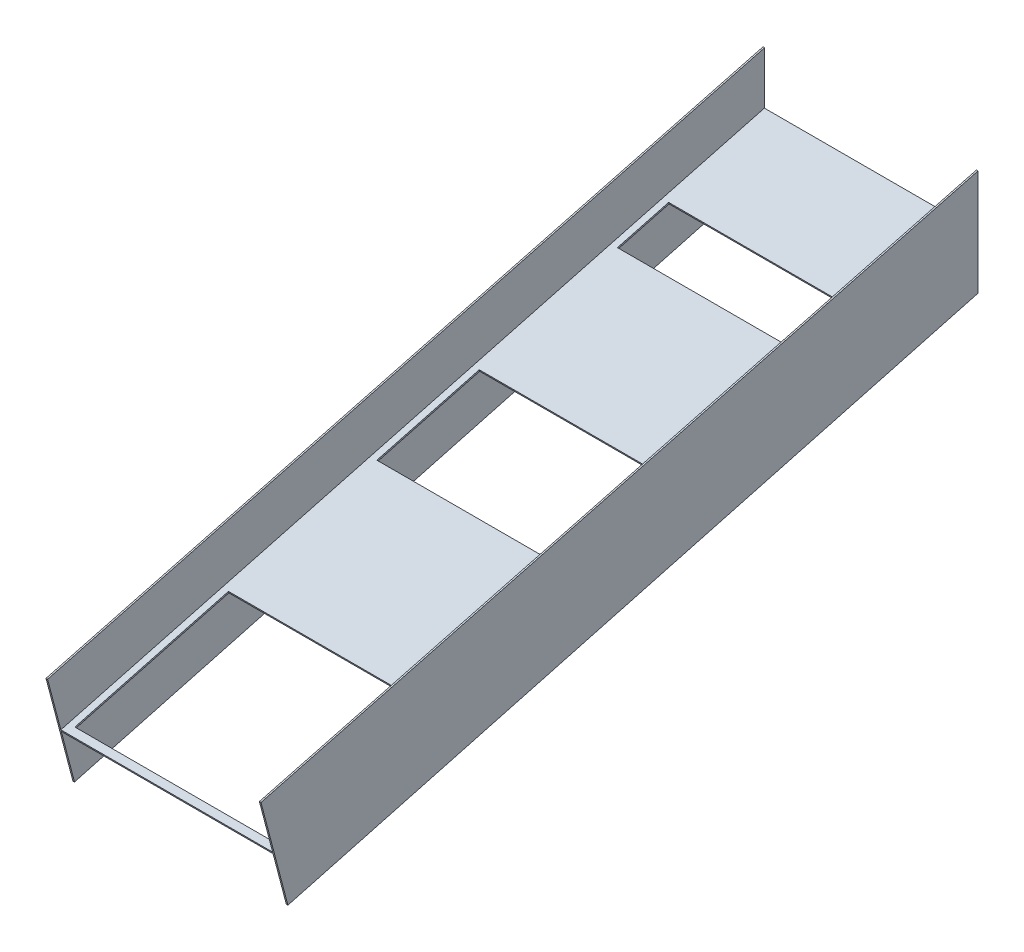
ISO-10303-21;
HEADER;
FILE_DESCRIPTION(('STEP AP214'),'2;1');
FILE_NAME('part.step','',(''),(''),'','','');
FILE_SCHEMA(('AUTOMOTIVE_DESIGN { 1 0 10303 214 1 1 1 1 }'));
ENDSEC;
DATA;
#1=APPLICATION_CONTEXT('core data for automotive mechanical design processes');
#2=APPLICATION_PROTOCOL_DEFINITION('international standard','automotive_design',2000,#1);
#3=PRODUCT_CONTEXT('',#1,'mechanical');
#4=PRODUCT('Part','Part','',(#3));
#5=PRODUCT_RELATED_PRODUCT_CATEGORY('part','',(#4));
#6=PRODUCT_DEFINITION_FORMATION('','',#4);
#7=PRODUCT_DEFINITION_CONTEXT('part definition',#1,'design');
#8=PRODUCT_DEFINITION('design','',#6,#7);
#9=PRODUCT_DEFINITION_SHAPE('','',#8);
#10=(LENGTH_UNIT() NAMED_UNIT(*) SI_UNIT(.MILLI.,.METRE.));
#11=(NAMED_UNIT(*) PLANE_ANGLE_UNIT() SI_UNIT($,.RADIAN.));
#12=(NAMED_UNIT(*) SI_UNIT($,.STERADIAN.) SOLID_ANGLE_UNIT());
#13=UNCERTAINTY_MEASURE_WITH_UNIT(LENGTH_MEASURE(1.E-05),#10,'distance_accuracy_value','');
#14=(GEOMETRIC_REPRESENTATION_CONTEXT(3) GLOBAL_UNCERTAINTY_ASSIGNED_CONTEXT((#13)) GLOBAL_UNIT_ASSIGNED_CONTEXT((#10,
#11,#12)) REPRESENTATION_CONTEXT('',''));
#15=CARTESIAN_POINT('',(0.,0.,0.));
#16=DIRECTION('',(0.,0.,1.));
#17=DIRECTION('',(1.,0.,0.));
#18=AXIS2_PLACEMENT_3D('',#15,#16,#17);
#19=CARTESIAN_POINT('',(-403.,0.,0.));
#20=DIRECTION('',(1.,0.,0.));
#21=DIRECTION('',(0.,0.,-1.));
#22=AXIS2_PLACEMENT_3D('',#19,#20,#21);
#23=PLANE('',#22);
#24=DIRECTION('',(0.,-1.,0.));
#25=VECTOR('',#24,1.);
#26=CARTESIAN_POINT('',(-403.,-200.,0.));
#27=LINE('',#26,#25);
#28=CARTESIAN_POINT('',(-403.,-100.,0.));
#29=VERTEX_POINT('',#28);
#30=CARTESIAN_POINT('',(-403.,-101.551888617157,0.));
#31=VERTEX_POINT('',#30);
#32=EDGE_CURVE('E11',#29,#31,#27,.T.);
#33=ORIENTED_EDGE('',*,*,#32,.F.);
#34=DIRECTION('',(0.,0.966564213060326,0.256424690759436));
#35=VECTOR('',#34,1.);
#36=CARTESIAN_POINT('',(-403.,-101.44984631959,-0.384637036139165));
#37=LINE('',#36,#35);
#38=CARTESIAN_POINT('',(-403.,-101.44984631959,-0.384637036139165));
#39=VERTEX_POINT('',#38);
#40=EDGE_CURVE('E876',#39,#29,#37,.T.);
#41=ORIENTED_EDGE('',*,*,#40,.F.);
#42=DIRECTION('',(0.,-0.256424690759435,0.966564213060327));
#43=VECTOR('',#42,1.);
#44=CARTESIAN_POINT('',(-403.,-101.44984631959,-0.384637036139165));
#45=LINE('',#44,#43);
#46=EDGE_CURVE('E459',#39,#31,#45,.T.);
#47=ORIENTED_EDGE('',*,*,#46,.T.);
#48=EDGE_LOOP('',(#33,#41,#47));
#49=FACE_BOUND('',#48,.T.);
#50=ADVANCED_FACE('F39',(#49),#23,.F.);
#51=CARTESIAN_POINT('',(-3.,0.,0.));
#52=DIRECTION('',(-1.,0.,0.));
#53=DIRECTION('',(0.,0.,1.));
#54=AXIS2_PLACEMENT_3D('',#51,#52,#53);
#55=PLANE('',#54);
#56=DIRECTION('',(0.,1.,0.));
#57=VECTOR('',#56,1.);
#58=CARTESIAN_POINT('',(-3.,0.,0.));
#59=LINE('',#58,#57);
#60=CARTESIAN_POINT('',(-3.,-100.,0.));
#61=VERTEX_POINT('',#60);
#62=CARTESIAN_POINT('',(-3.,0.,0.));
#63=VERTEX_POINT('',#62);
#64=EDGE_CURVE('E569',#61,#63,#59,.T.);
#65=ORIENTED_EDGE('',*,*,#64,.F.);
#66=DIRECTION('',(0.,0.966564213060326,0.256424690759436));
#67=VECTOR('',#66,1.);
#68=CARTESIAN_POINT('',(-3.,-101.44984631959,-0.384637036139165));
#69=LINE('',#68,#67);
#70=CARTESIAN_POINT('',(-3.,-98.5501536804095,0.38463703613914));
#71=VERTEX_POINT('',#70);
#72=EDGE_CURVE('E476',#61,#71,#69,.T.);
#73=ORIENTED_EDGE('',*,*,#72,.T.);
#74=DIRECTION('',(0.,-0.256424690759435,0.966564213060327));
#75=VECTOR('',#74,1.);
#76=CARTESIAN_POINT('',(-3.,-98.5501536804095,0.38463703613914));
#77=LINE('',#76,#75);
#78=CARTESIAN_POINT('',(-3.,-451.029111549455,1329.01467466633));
#79=VERTEX_POINT('',#78);
#80=EDGE_CURVE('E474',#71,#79,#77,.T.);
#81=ORIENTED_EDGE('',*,*,#80,.T.);
#82=CARTESIAN_POINT('',(-3.,-355.762035513731,1354.04334276534));
#83=DIRECTION('',(0.,-0.967173816260954,-0.254115739652666));
#84=VECTOR('',#83,1.);
#85=LINE('',#82,#84);
#86=CARTESIAN_POINT('',(-3.,-355.762035513731,1354.04334276534));
#87=VERTEX_POINT('',#86);
#88=EDGE_CURVE('E514',#87,#79,#85,.T.);
#89=ORIENTED_EDGE('',*,*,#88,.F.);
#90=DIRECTION('',(0.,-0.254115739652665,0.967173816260955));
#91=VECTOR('',#90,1.);
#92=CARTESIAN_POINT('',(-3.,0.,0.));
#93=LINE('',#92,#91);
#94=EDGE_CURVE('E576',#63,#87,#93,.T.);
#95=ORIENTED_EDGE('',*,*,#94,.F.);
#96=EDGE_LOOP('',(#65,#73,#81,#89,#95));
#97=FACE_BOUND('',#96,.T.);
#98=ADVANCED_FACE('F412',(#97),#55,.T.);
#99=CARTESIAN_POINT('',(-3.,0.,0.));
#100=DIRECTION('',(0.,0.,-1.));
#101=DIRECTION('',(0.,1.,0.));
#102=AXIS2_PLACEMENT_3D('',#99,#100,#101);
#103=PLANE('',#102);
#104=DIRECTION('',(0.,1.,0.));
#105=VECTOR('',#104,1.);
#106=CARTESIAN_POINT('',(0.,0.,0.));
#107=LINE('',#106,#105);
#108=CARTESIAN_POINT('',(0.,-200.,0.));
#109=VERTEX_POINT('',#108);
#110=CARTESIAN_POINT('',(0.,0.,0.));
#111=VERTEX_POINT('',#110);
#112=EDGE_CURVE('E553',#109,#111,#107,.T.);
#113=ORIENTED_EDGE('',*,*,#112,.F.);
#114=DIRECTION('',(1.,0.,0.));
#115=VECTOR('',#114,1.);
#116=CARTESIAN_POINT('',(-3.,-200.,0.));
#117=LINE('',#116,#115);
#118=CARTESIAN_POINT('',(-3.,-200.,0.));
#119=VERTEX_POINT('',#118);
#120=EDGE_CURVE('E488',#119,#109,#117,.T.);
#121=ORIENTED_EDGE('',*,*,#120,.F.);
#122=CARTESIAN_POINT('',(-3.,-101.551888617157,0.));
#123=VERTEX_POINT('',#122);
#124=EDGE_CURVE('E565',#119,#123,#59,.T.);
#125=ORIENTED_EDGE('',*,*,#124,.T.);
#126=EDGE_CURVE('E571',#123,#61,#59,.T.);
#127=ORIENTED_EDGE('',*,*,#126,.T.);
#128=ORIENTED_EDGE('',*,*,#64,.T.);
#129=DIRECTION('',(1.,0.,0.));
#130=VECTOR('',#129,1.);
#131=CARTESIAN_POINT('',(-3.,0.,0.));
#132=LINE('',#131,#130);
#133=EDGE_CURVE('E505',#63,#111,#132,.T.);
#134=ORIENTED_EDGE('',*,*,#133,.T.);
#135=EDGE_LOOP('',(#113,#121,#125,#127,#128,#134));
#136=FACE_BOUND('',#135,.T.);
#137=ADVANCED_FACE('F41',(#136),#103,.T.);
#138=CARTESIAN_POINT('',(-3.,-549.196798765922,1303.2201948348));
#139=DIRECTION('',(0.,-0.965925826289067,-0.258819045102525));
#140=DIRECTION('',(0.,0.258819045102525,-0.965925826289067));
#141=AXIS2_PLACEMENT_3D('',#138,#139,#140);
#142=PLANE('',#141);
#143=DIRECTION('',(0.,0.258819045102525,-0.965925826289067));
#144=VECTOR('',#143,1.);
#145=CARTESIAN_POINT('',(0.,-549.196798765922,1303.2201948348));
#146=LINE('',#145,#144);
#147=CARTESIAN_POINT('',(0.,-549.196798765922,1303.2201948348));
#148=VERTEX_POINT('',#147);
#149=EDGE_CURVE('E503',#148,#109,#146,.T.);
#150=ORIENTED_EDGE('',*,*,#149,.F.);
#151=DIRECTION('',(1.,0.,0.));
#152=VECTOR('',#151,1.);
#153=CARTESIAN_POINT('',(-3.,-549.196798765922,1303.2201948348));
#154=LINE('',#153,#152);
#155=CARTESIAN_POINT('',(-3.,-549.196798765922,1303.2201948348));
#156=VERTEX_POINT('',#155);
#157=EDGE_CURVE('E492',#156,#148,#154,.T.);
#158=ORIENTED_EDGE('',*,*,#157,.F.);
#159=DIRECTION('',(0.,0.258819045102525,-0.965925826289067));
#160=VECTOR('',#159,1.);
#161=CARTESIAN_POINT('',(-3.,-549.196798765922,1303.2201948348));
#162=LINE('',#161,#160);
#163=EDGE_CURVE('E508',#156,#119,#162,.T.);
#164=ORIENTED_EDGE('',*,*,#163,.T.);
#165=ORIENTED_EDGE('',*,*,#120,.T.);
#166=EDGE_LOOP('',(#150,#158,#164,#165));
#167=FACE_BOUND('',#166,.T.);
#168=ADVANCED_FACE('F532',(#167),#142,.T.);
#169=CARTESIAN_POINT('',(-3.,-355.762035513731,1354.04334276534));
#170=DIRECTION('',(0.,-0.254115739652666,0.967173816260954));
#171=DIRECTION('',(0.,-0.967173816260955,-0.254115739652666));
#172=AXIS2_PLACEMENT_3D('',#169,#170,#171);
#173=PLANE('',#172);
#174=DIRECTION('',(0.,-0.967173816260954,-0.254115739652666));
#175=VECTOR('',#174,1.);
#176=CARTESIAN_POINT('',(0.,-355.762035513731,1354.04334276534));
#177=LINE('',#176,#175);
#178=CARTESIAN_POINT('',(0.,-355.762035513731,1354.04334276534));
#179=VERTEX_POINT('',#178);
#180=EDGE_CURVE('E552',#179,#148,#177,.T.);
#181=ORIENTED_EDGE('',*,*,#180,.F.);
#182=DIRECTION('',(1.,0.,0.));
#183=VECTOR('',#182,1.);
#184=CARTESIAN_POINT('',(-3.,-355.762035513731,1354.04334276534));
#185=LINE('',#184,#183);
#186=EDGE_CURVE('E499',#87,#179,#185,.T.);
#187=ORIENTED_EDGE('',*,*,#186,.F.);
#188=ORIENTED_EDGE('',*,*,#88,.T.);
#189=CARTESIAN_POINT('',(-3.,-451.028652278673,1329.01294349644));
#190=DIRECTION('',(0.,-0.967173816260954,-0.254115739652669));
#191=VECTOR('',#190,1.);
#192=LINE('',#189,#191);
#193=CARTESIAN_POINT('',(-3.,-453.929722730199,1328.24886293381));
#194=VERTEX_POINT('',#193);
#195=EDGE_CURVE('E482',#79,#194,#192,.T.);
#196=ORIENTED_EDGE('',*,*,#195,.T.);
#197=CARTESIAN_POINT('',(-3.,-453.930182000981,1328.2505941037));
#198=DIRECTION('',(0.,-0.967173816260954,-0.254115739652666));
#199=VECTOR('',#198,1.);
#200=LINE('',#197,#199);
#201=EDGE_CURVE('E579',#194,#156,#200,.T.);
#202=ORIENTED_EDGE('',*,*,#201,.T.);
#203=ORIENTED_EDGE('',*,*,#157,.T.);
#204=EDGE_LOOP('',(#181,#187,#188,#196,#202,#203));
#205=FACE_BOUND('',#204,.T.);
#206=ADVANCED_FACE('F522',(#205),#173,.T.);
#207=CARTESIAN_POINT('',(-3.,0.,0.));
#208=DIRECTION('',(0.,0.967173816260955,0.254115739652665));
#209=DIRECTION('',(0.,-0.254115739652665,0.967173816260955));
#210=AXIS2_PLACEMENT_3D('',#207,#208,#209);
#211=PLANE('',#210);
#212=DIRECTION('',(0.,-0.254115739652665,0.967173816260955));
#213=VECTOR('',#212,1.);
#214=CARTESIAN_POINT('',(0.,0.,0.));
#215=LINE('',#214,#213);
#216=EDGE_CURVE('E544',#111,#179,#215,.T.);
#217=ORIENTED_EDGE('',*,*,#216,.F.);
#218=ORIENTED_EDGE('',*,*,#133,.F.);
#219=ORIENTED_EDGE('',*,*,#94,.T.);
#220=ORIENTED_EDGE('',*,*,#186,.T.);
#221=EDGE_LOOP('',(#217,#218,#219,#220));
#222=FACE_BOUND('',#221,.T.);
#223=ADVANCED_FACE('F531',(#222),#211,.T.);
#224=DIRECTION('',(0.,-0.256424690759435,0.966564213060327));
#225=VECTOR('',#224,1.);
#226=CARTESIAN_POINT('',(-3.,-101.44984631959,-0.384637036139165));
#227=LINE('',#226,#225);
#228=EDGE_CURVE('E49',#123,#194,#227,.T.);
#229=ORIENTED_EDGE('',*,*,#228,.F.);
#230=ORIENTED_EDGE('',*,*,#124,.F.);
#231=ORIENTED_EDGE('',*,*,#163,.F.);
#232=ORIENTED_EDGE('',*,*,#201,.F.);
#233=EDGE_LOOP('',(#229,#230,#231,#232));
#234=FACE_BOUND('',#233,.T.);
#235=ADVANCED_FACE('F535',(#234),#55,.T.);
#236=CARTESIAN_POINT('',(0.,0.,0.));
#237=DIRECTION('',(-1.,0.,0.));
#238=DIRECTION('',(0.,0.,1.));
#239=AXIS2_PLACEMENT_3D('',#236,#237,#238);
#240=PLANE('',#239);
#241=ORIENTED_EDGE('',*,*,#112,.T.);
#242=ORIENTED_EDGE('',*,*,#216,.T.);
#243=ORIENTED_EDGE('',*,*,#180,.T.);
#244=ORIENTED_EDGE('',*,*,#149,.T.);
#245=EDGE_LOOP('',(#241,#242,#243,#244));
#246=FACE_BOUND('',#245,.T.);
#247=ADVANCED_FACE('F417',(#246),#240,.F.);
#248=CARTESIAN_POINT('',(-3.,0.,0.));
#249=DIRECTION('',(1.,0.,0.));
#250=DIRECTION('',(0.,0.,-1.));
#251=AXIS2_PLACEMENT_3D('',#248,#249,#250);
#252=PLANE('',#251);
#253=ORIENTED_EDGE('',*,*,#126,.F.);
#254=CARTESIAN_POINT('',(-3.,-101.44984631959,-0.384637036139165));
#255=VERTEX_POINT('',#254);
#256=EDGE_CURVE('E862',#255,#123,#227,.T.);
#257=ORIENTED_EDGE('',*,*,#256,.F.);
#258=EDGE_CURVE('E469',#255,#61,#69,.T.);
#259=ORIENTED_EDGE('',*,*,#258,.T.);
#260=EDGE_LOOP('',(#253,#257,#259));
#261=FACE_BOUND('',#260,.T.);
#262=ADVANCED_FACE('F414',(#261),#252,.T.);
#263=CARTESIAN_POINT('',(-403.,-101.44984631959,-0.384637036139165));
#264=DIRECTION('',(0.,0.966564213060326,0.256424690759435));
#265=DIRECTION('',(0.,-0.256424690759435,0.966564213060326));
#266=AXIS2_PLACEMENT_3D('',#263,#264,#265);
#267=PLANE('',#266);
#268=DIRECTION('',(1.,0.,0.));
#269=VECTOR('',#268,1.);
#270=CARTESIAN_POINT('',(-390.5,-178.377253547421,289.584626881959));
#271=LINE('',#270,#269);
#272=CARTESIAN_POINT('',(-390.5,-178.377253547421,289.584626881959));
#273=VERTEX_POINT('',#272);
#274=CARTESIAN_POINT('',(-15.5,-178.377253547421,289.584626881959));
#275=VERTEX_POINT('',#274);
#276=EDGE_CURVE('E230',#273,#275,#271,.T.);
#277=ORIENTED_EDGE('',*,*,#276,.T.);
#278=DIRECTION('',(0.,0.256424690759435,-0.966564213060326));
#279=VECTOR('',#278,1.);
#280=CARTESIAN_POINT('',(-15.5,-152.734784471478,192.928205575926));
#281=LINE('',#280,#279);
#282=CARTESIAN_POINT('',(-15.5,-152.734784471478,192.928205575926));
#283=VERTEX_POINT('',#282);
#284=EDGE_CURVE('E221',#275,#283,#281,.T.);
#285=ORIENTED_EDGE('',*,*,#284,.T.);
#286=DIRECTION('',(-1.,0.,0.));
#287=VECTOR('',#286,1.);
#288=CARTESIAN_POINT('',(-390.5,-152.734784471478,192.928205575926));
#289=LINE('',#288,#287);
#290=CARTESIAN_POINT('',(-390.5,-152.734784471478,192.928205575926));
#291=VERTEX_POINT('',#290);
#292=EDGE_CURVE('E233',#283,#291,#289,.T.);
#293=ORIENTED_EDGE('',*,*,#292,.T.);
#294=DIRECTION('',(0.,-0.256424690759435,0.966564213060326));
#295=VECTOR('',#294,1.);
#296=CARTESIAN_POINT('',(-390.5,-152.734784471478,192.928205575926));
#297=LINE('',#296,#295);
#298=EDGE_CURVE('E59',#291,#273,#297,.T.);
#299=ORIENTED_EDGE('',*,*,#298,.T.);
#300=EDGE_LOOP('',(#277,#285,#293,#299));
#301=FACE_BOUND('',#300,.T.);
#302=DIRECTION('',(1.,0.,0.));
#303=VECTOR('',#302,1.);
#304=CARTESIAN_POINT('',(-390.5,-298.896858204356,743.869807020312));
#305=LINE('',#304,#303);
#306=CARTESIAN_POINT('',(-390.5,-298.896858204356,743.869807020312));
#307=VERTEX_POINT('',#306);
#308=CARTESIAN_POINT('',(-15.4999999999998,-298.896858204356,743.869807020312));
#309=VERTEX_POINT('',#308);
#310=EDGE_CURVE('E282',#307,#309,#305,.T.);
#311=ORIENTED_EDGE('',*,*,#310,.T.);
#312=DIRECTION('',(0.,0.256424690759435,-0.966564213060326));
#313=VECTOR('',#312,1.);
#314=CARTESIAN_POINT('',(-15.4999999999998,-247.611920052469,550.556964408247));
#315=LINE('',#314,#313);
#316=CARTESIAN_POINT('',(-15.4999999999998,-247.611920052469,550.556964408247));
#317=VERTEX_POINT('',#316);
#318=EDGE_CURVE('E271',#309,#317,#315,.T.);
#319=ORIENTED_EDGE('',*,*,#318,.T.);
#320=DIRECTION('',(-1.,0.,0.));
#321=VECTOR('',#320,1.);
#322=CARTESIAN_POINT('',(-390.5,-247.611920052469,550.556964408247));
#323=LINE('',#322,#321);
#324=CARTESIAN_POINT('',(-390.5,-247.611920052469,550.556964408247));
#325=VERTEX_POINT('',#324);
#326=EDGE_CURVE('E275',#317,#325,#323,.T.);
#327=ORIENTED_EDGE('',*,*,#326,.T.);
#328=DIRECTION('',(0.,-0.256424690759435,0.966564213060326));
#329=VECTOR('',#328,1.);
#330=CARTESIAN_POINT('',(-390.5,-247.611920052469,550.556964408247));
#331=LINE('',#330,#329);
#332=EDGE_CURVE('E67',#325,#307,#331,.T.);
#333=ORIENTED_EDGE('',*,*,#332,.T.);
#334=EDGE_LOOP('',(#311,#319,#327,#333));
#335=FACE_BOUND('',#334,.T.);
#336=DIRECTION('',(1.,0.,0.));
#337=VECTOR('',#336,1.);
#338=CARTESIAN_POINT('',(-390.5,-450.187425752422,1314.14269272591));
#339=LINE('',#338,#337);
#340=CARTESIAN_POINT('',(-390.5,-450.187425752422,1314.14269272591));
#341=VERTEX_POINT('',#340);
#342=CARTESIAN_POINT('',(-15.4999999999998,-450.187425752422,1314.14269272591));
#343=VERTEX_POINT('',#342);
#344=EDGE_CURVE('E326',#341,#343,#339,.T.);
#345=ORIENTED_EDGE('',*,*,#344,.T.);
#346=DIRECTION('',(0.,0.256424690759435,-0.966564213060326));
#347=VECTOR('',#346,1.);
#348=CARTESIAN_POINT('',(-15.4999999999998,-373.260018524592,1024.17342880781));
#349=LINE('',#348,#347);
#350=CARTESIAN_POINT('',(-15.4999999999998,-373.260018524592,1024.17342880781));
#351=VERTEX_POINT('',#350);
#352=EDGE_CURVE('E313',#343,#351,#349,.T.);
#353=ORIENTED_EDGE('',*,*,#352,.T.);
#354=DIRECTION('',(-1.,0.,0.));
#355=VECTOR('',#354,1.);
#356=CARTESIAN_POINT('',(-390.5,-373.260018524592,1024.17342880781));
#357=LINE('',#356,#355);
#358=CARTESIAN_POINT('',(-390.5,-373.260018524592,1024.17342880781));
#359=VERTEX_POINT('',#358);
#360=EDGE_CURVE('E317',#351,#359,#357,.T.);
#361=ORIENTED_EDGE('',*,*,#360,.T.);
#362=DIRECTION('',(0.,-0.256424690759435,0.966564213060326));
#363=VECTOR('',#362,1.);
#364=CARTESIAN_POINT('',(-390.5,-373.260018524592,1024.17342880781));
#365=LINE('',#364,#363);
#366=EDGE_CURVE('E322',#359,#341,#365,.T.);
#367=ORIENTED_EDGE('',*,*,#366,.T.);
#368=EDGE_LOOP('',(#345,#353,#361,#367));
#369=FACE_BOUND('',#368,.T.);
#370=ORIENTED_EDGE('',*,*,#256,.T.);
#371=ORIENTED_EDGE('',*,*,#228,.T.);
#372=DIRECTION('',(1.,0.,0.));
#373=VECTOR('',#372,1.);
#374=CARTESIAN_POINT('',(-403.,-453.929263459417,1328.24713176393));
#375=LINE('',#374,#373);
#376=CARTESIAN_POINT('',(-403.,-453.929722730199,1328.24886293381));
#377=VERTEX_POINT('',#376);
#378=EDGE_CURVE('E558',#377,#194,#375,.T.);
#379=ORIENTED_EDGE('',*,*,#378,.F.);
#380=EDGE_CURVE('E43',#31,#377,#45,.T.);
#381=ORIENTED_EDGE('',*,*,#380,.F.);
#382=ORIENTED_EDGE('',*,*,#46,.F.);
#383=DIRECTION('',(1.,0.,0.));
#384=VECTOR('',#383,1.);
#385=CARTESIAN_POINT('',(-403.,-101.44984631959,-0.384637036139165));
#386=LINE('',#385,#384);
#387=EDGE_CURVE('E918',#39,#255,#386,.T.);
#388=ORIENTED_EDGE('',*,*,#387,.T.);
#389=EDGE_LOOP('',(#370,#371,#379,#381,#382,#388));
#390=FACE_BOUND('',#389,.T.);
#391=ADVANCED_FACE('F238',(#301,#335,#369,#390),#267,.F.);
#392=CARTESIAN_POINT('',(-403.,-451.029570820236,1329.01640583621));
#393=DIRECTION('',(0.,-0.256424690759414,0.966564213060332));
#394=DIRECTION('',(0.,-0.966564213060332,-0.256424690759414));
#395=AXIS2_PLACEMENT_3D('',#392,#393,#394);
#396=PLANE('',#395);
#397=ORIENTED_EDGE('',*,*,#195,.F.);
#398=DIRECTION('',(1.,0.,0.));
#399=VECTOR('',#398,1.);
#400=CARTESIAN_POINT('',(-403.,-451.029570820236,1329.01640583621));
#401=LINE('',#400,#399);
#402=CARTESIAN_POINT('',(-403.,-451.029111549455,1329.01467466633));
#403=VERTEX_POINT('',#402);
#404=EDGE_CURVE('E562',#403,#79,#401,.T.);
#405=ORIENTED_EDGE('',*,*,#404,.F.);
#406=CARTESIAN_POINT('',(-403.,-451.029570820236,1329.01640583621));
#407=DIRECTION('',(0.,-0.966564213060332,-0.256424690759413));
#408=VECTOR('',#407,1.);
#409=LINE('',#406,#408);
#410=EDGE_CURVE('E456',#403,#377,#409,.T.);
#411=ORIENTED_EDGE('',*,*,#410,.T.);
#412=ORIENTED_EDGE('',*,*,#378,.T.);
#413=EDGE_LOOP('',(#397,#405,#411,#412));
#414=FACE_BOUND('',#413,.T.);
#415=ADVANCED_FACE('F426',(#414),#396,.T.);
#416=CARTESIAN_POINT('',(-403.,-98.5501536804095,0.38463703613914));
#417=DIRECTION('',(0.,0.966564213060326,0.256424690759435));
#418=DIRECTION('',(0.,-0.256424690759435,0.966564213060326));
#419=AXIS2_PLACEMENT_3D('',#416,#417,#418);
#420=PLANE('',#419);
#421=DIRECTION('',(0.,0.256424690759435,-0.966564213060326));
#422=VECTOR('',#421,1.);
#423=CARTESIAN_POINT('',(-15.5,-149.835091832297,193.697479648204));
#424=LINE('',#423,#422);
#425=CARTESIAN_POINT('',(-15.5,-175.47756090824,290.353900954237));
#426=VERTEX_POINT('',#425);
#427=CARTESIAN_POINT('',(-15.5,-149.835091832297,193.697479648204));
#428=VERTEX_POINT('',#427);
#429=EDGE_CURVE('E224',#426,#428,#424,.T.);
#430=ORIENTED_EDGE('',*,*,#429,.F.);
#431=DIRECTION('',(1.,0.,0.));
#432=VECTOR('',#431,1.);
#433=CARTESIAN_POINT('',(-390.5,-175.47756090824,290.353900954237));
#434=LINE('',#433,#432);
#435=CARTESIAN_POINT('',(-390.5,-175.47756090824,290.353900954237));
#436=VERTEX_POINT('',#435);
#437=EDGE_CURVE('E242',#436,#426,#434,.T.);
#438=ORIENTED_EDGE('',*,*,#437,.F.);
#439=DIRECTION('',(0.,-0.256424690759435,0.966564213060326));
#440=VECTOR('',#439,1.);
#441=CARTESIAN_POINT('',(-390.5,-149.835091832297,193.697479648204));
#442=LINE('',#441,#440);
#443=CARTESIAN_POINT('',(-390.5,-149.835091832297,193.697479648204));
#444=VERTEX_POINT('',#443);
#445=EDGE_CURVE('E246',#444,#436,#442,.T.);
#446=ORIENTED_EDGE('',*,*,#445,.F.);
#447=DIRECTION('',(-1.,0.,0.));
#448=VECTOR('',#447,1.);
#449=CARTESIAN_POINT('',(-390.5,-149.835091832297,193.697479648204));
#450=LINE('',#449,#448);
#451=EDGE_CURVE('E255',#428,#444,#450,.T.);
#452=ORIENTED_EDGE('',*,*,#451,.F.);
#453=EDGE_LOOP('',(#430,#438,#446,#452));
#454=FACE_BOUND('',#453,.T.);
#455=DIRECTION('',(0.,0.256424690759435,-0.966564213060326));
#456=VECTOR('',#455,1.);
#457=CARTESIAN_POINT('',(-15.4999999999998,-244.712227413288,551.326238480525));
#458=LINE('',#457,#456);
#459=CARTESIAN_POINT('',(-15.4999999999998,-295.997165565175,744.63908109259));
#460=VERTEX_POINT('',#459);
#461=CARTESIAN_POINT('',(-15.4999999999998,-244.712227413288,551.326238480525));
#462=VERTEX_POINT('',#461);
#463=EDGE_CURVE('E287',#460,#462,#458,.T.);
#464=ORIENTED_EDGE('',*,*,#463,.F.);
#465=DIRECTION('',(1.,0.,0.));
#466=VECTOR('',#465,1.);
#467=CARTESIAN_POINT('',(-390.5,-295.997165565175,744.63908109259));
#468=LINE('',#467,#466);
#469=CARTESIAN_POINT('',(-390.5,-295.997165565175,744.63908109259));
#470=VERTEX_POINT('',#469);
#471=EDGE_CURVE('E276',#470,#460,#468,.T.);
#472=ORIENTED_EDGE('',*,*,#471,.F.);
#473=DIRECTION('',(0.,-0.256424690759435,0.966564213060326));
#474=VECTOR('',#473,1.);
#475=CARTESIAN_POINT('',(-390.5,-244.712227413288,551.326238480525));
#476=LINE('',#475,#474);
#477=CARTESIAN_POINT('',(-390.5,-244.712227413288,551.326238480525));
#478=VERTEX_POINT('',#477);
#479=EDGE_CURVE('E295',#478,#470,#476,.T.);
#480=ORIENTED_EDGE('',*,*,#479,.F.);
#481=DIRECTION('',(-1.,0.,0.));
#482=VECTOR('',#481,1.);
#483=CARTESIAN_POINT('',(-390.5,-244.712227413288,551.326238480525));
#484=LINE('',#483,#482);
#485=EDGE_CURVE('E290',#462,#478,#484,.T.);
#486=ORIENTED_EDGE('',*,*,#485,.F.);
#487=EDGE_LOOP('',(#464,#472,#480,#486));
#488=FACE_BOUND('',#487,.T.);
#489=DIRECTION('',(0.,0.256424690759435,-0.966564213060326));
#490=VECTOR('',#489,1.);
#491=CARTESIAN_POINT('',(-15.4999999999998,-370.360325885411,1024.94270288009));
#492=LINE('',#491,#490);
#493=CARTESIAN_POINT('',(-15.4999999999998,-447.287733113241,1314.91196679818));
#494=VERTEX_POINT('',#493);
#495=CARTESIAN_POINT('',(-15.4999999999998,-370.360325885411,1024.94270288009));
#496=VERTEX_POINT('',#495);
#497=EDGE_CURVE('E331',#494,#496,#492,.T.);
#498=ORIENTED_EDGE('',*,*,#497,.F.);
#499=DIRECTION('',(1.,0.,0.));
#500=VECTOR('',#499,1.);
#501=CARTESIAN_POINT('',(-390.5,-447.287733113241,1314.91196679818));
#502=LINE('',#501,#500);
#503=CARTESIAN_POINT('',(-390.5,-447.287733113241,1314.91196679818));
#504=VERTEX_POINT('',#503);
#505=EDGE_CURVE('E318',#504,#494,#502,.T.);
#506=ORIENTED_EDGE('',*,*,#505,.F.);
#507=DIRECTION('',(0.,-0.256424690759435,0.966564213060326));
#508=VECTOR('',#507,1.);
#509=CARTESIAN_POINT('',(-390.5,-370.360325885411,1024.94270288009));
#510=LINE('',#509,#508);
#511=CARTESIAN_POINT('',(-390.5,-370.360325885411,1024.94270288009));
#512=VERTEX_POINT('',#511);
#513=EDGE_CURVE('E338',#512,#504,#510,.T.);
#514=ORIENTED_EDGE('',*,*,#513,.F.);
#515=DIRECTION('',(-1.,0.,0.));
#516=VECTOR('',#515,1.);
#517=CARTESIAN_POINT('',(-390.5,-370.360325885411,1024.94270288009));
#518=LINE('',#517,#516);
#519=EDGE_CURVE('E334',#496,#512,#518,.T.);
#520=ORIENTED_EDGE('',*,*,#519,.F.);
#521=EDGE_LOOP('',(#498,#506,#514,#520));
#522=FACE_BOUND('',#521,.T.);
#523=ORIENTED_EDGE('',*,*,#80,.F.);
#524=DIRECTION('',(1.,0.,0.));
#525=VECTOR('',#524,1.);
#526=CARTESIAN_POINT('',(-403.,-98.5501536804095,0.38463703613914));
#527=LINE('',#526,#525);
#528=CARTESIAN_POINT('',(-403.,-98.5501536804095,0.38463703613914));
#529=VERTEX_POINT('',#528);
#530=EDGE_CURVE('E920',#529,#71,#527,.T.);
#531=ORIENTED_EDGE('',*,*,#530,.F.);
#532=DIRECTION('',(0.,-0.256424690759435,0.966564213060327));
#533=VECTOR('',#532,1.);
#534=CARTESIAN_POINT('',(-403.,-98.5501536804095,0.38463703613914));
#535=LINE('',#534,#533);
#536=EDGE_CURVE('E446',#529,#403,#535,.T.);
#537=ORIENTED_EDGE('',*,*,#536,.T.);
#538=ORIENTED_EDGE('',*,*,#404,.T.);
#539=EDGE_LOOP('',(#523,#531,#537,#538));
#540=FACE_BOUND('',#539,.T.);
#541=ADVANCED_FACE('F422',(#454,#488,#522,#540),#420,.T.);
#542=CARTESIAN_POINT('',(-403.,-101.44984631959,-0.384637036139165));
#543=DIRECTION('',(0.,0.256424690759436,-0.966564213060326));
#544=DIRECTION('',(0.,0.966564213060326,0.256424690759436));
#545=AXIS2_PLACEMENT_3D('',#542,#543,#544);
#546=PLANE('',#545);
#547=ORIENTED_EDGE('',*,*,#258,.F.);
#548=ORIENTED_EDGE('',*,*,#387,.F.);
#549=ORIENTED_EDGE('',*,*,#40,.T.);
#550=EDGE_CURVE('E455',#29,#529,#37,.T.);
#551=ORIENTED_EDGE('',*,*,#550,.T.);
#552=ORIENTED_EDGE('',*,*,#530,.T.);
#553=ORIENTED_EDGE('',*,*,#72,.F.);
#554=EDGE_LOOP('',(#547,#548,#549,#551,#552,#553));
#555=FACE_BOUND('',#554,.T.);
#556=ADVANCED_FACE('F419',(#555),#546,.T.);
#557=CARTESIAN_POINT('',(-403.,0.,0.));
#558=DIRECTION('',(-1.,0.,0.));
#559=DIRECTION('',(0.,0.,1.));
#560=AXIS2_PLACEMENT_3D('',#557,#558,#559);
#561=PLANE('',#560);
#562=CARTESIAN_POINT('',(-403.,-200.,0.));
#563=VERTEX_POINT('',#562);
#564=EDGE_CURVE('E52',#31,#563,#27,.T.);
#565=ORIENTED_EDGE('',*,*,#564,.F.);
#566=ORIENTED_EDGE('',*,*,#380,.T.);
#567=CARTESIAN_POINT('',(-403.,-549.196798765922,1303.2201948348));
#568=DIRECTION('',(0.,0.967173816260954,0.254115739652666));
#569=VECTOR('',#568,1.);
#570=LINE('',#567,#569);
#571=CARTESIAN_POINT('',(-403.,-549.196798765922,1303.2201948348));
#572=VERTEX_POINT('',#571);
#573=EDGE_CURVE('E385',#572,#377,#570,.T.);
#574=ORIENTED_EDGE('',*,*,#573,.F.);
#575=DIRECTION('',(0.,-0.258819045102525,0.965925826289067));
#576=VECTOR('',#575,1.);
#577=CARTESIAN_POINT('',(-403.,-200.,0.));
#578=LINE('',#577,#576);
#579=EDGE_CURVE('E265',#563,#572,#578,.T.);
#580=ORIENTED_EDGE('',*,*,#579,.F.);
#581=EDGE_LOOP('',(#565,#566,#574,#580));
#582=FACE_BOUND('',#581,.T.);
#583=ADVANCED_FACE('F408',(#582),#561,.F.);
#584=CARTESIAN_POINT('',(-406.,-200.,0.));
#585=DIRECTION('',(0.,0.965925826289067,0.258819045102525));
#586=DIRECTION('',(0.,-0.258819045102525,0.965925826289067));
#587=AXIS2_PLACEMENT_3D('',#584,#585,#586);
#588=PLANE('',#587);
#589=ORIENTED_EDGE('',*,*,#579,.T.);
#590=DIRECTION('',(1.,0.,0.));
#591=VECTOR('',#590,1.);
#592=CARTESIAN_POINT('',(-406.,-549.196798765922,1303.2201948348));
#593=LINE('',#592,#591);
#594=CARTESIAN_POINT('',(-406.,-549.196798765922,1303.2201948348));
#595=VERTEX_POINT('',#594);
#596=EDGE_CURVE('E880',#595,#572,#593,.T.);
#597=ORIENTED_EDGE('',*,*,#596,.F.);
#598=DIRECTION('',(0.,-0.258819045102525,0.965925826289067));
#599=VECTOR('',#598,1.);
#600=CARTESIAN_POINT('',(-406.,-200.,0.));
#601=LINE('',#600,#599);
#602=CARTESIAN_POINT('',(-406.,-200.,0.));
#603=VERTEX_POINT('',#602);
#604=EDGE_CURVE('E356',#603,#595,#601,.T.);
#605=ORIENTED_EDGE('',*,*,#604,.F.);
#606=DIRECTION('',(1.,0.,0.));
#607=VECTOR('',#606,1.);
#608=CARTESIAN_POINT('',(-406.,-200.,0.));
#609=LINE('',#608,#607);
#610=EDGE_CURVE('E368',#603,#563,#609,.T.);
#611=ORIENTED_EDGE('',*,*,#610,.T.);
#612=EDGE_LOOP('',(#589,#597,#605,#611));
#613=FACE_BOUND('',#612,.T.);
#614=ADVANCED_FACE('F404',(#613),#588,.F.);
#615=CARTESIAN_POINT('',(-406.,-549.196798765922,1303.2201948348));
#616=DIRECTION('',(0.,0.254115739652666,-0.967173816260954));
#617=DIRECTION('',(0.,0.967173816260955,0.254115739652666));
#618=AXIS2_PLACEMENT_3D('',#615,#616,#617);
#619=PLANE('',#618);
#620=ORIENTED_EDGE('',*,*,#573,.T.);
#621=ORIENTED_EDGE('',*,*,#410,.F.);
#622=CARTESIAN_POINT('',(-403.,-451.028652278673,1329.01294349644));
#623=DIRECTION('',(0.,0.967173816260954,0.254115739652666));
#624=VECTOR('',#623,1.);
#625=LINE('',#622,#624);
#626=CARTESIAN_POINT('',(-403.,-355.762035513731,1354.04334276534));
#627=VERTEX_POINT('',#626);
#628=EDGE_CURVE('E867',#403,#627,#625,.T.);
#629=ORIENTED_EDGE('',*,*,#628,.T.);
#630=DIRECTION('',(1.,0.,0.));
#631=VECTOR('',#630,1.);
#632=CARTESIAN_POINT('',(-406.,-355.762035513731,1354.04334276534));
#633=LINE('',#632,#631);
#634=CARTESIAN_POINT('',(-406.,-355.762035513731,1354.04334276534));
#635=VERTEX_POINT('',#634);
#636=EDGE_CURVE('E379',#635,#627,#633,.T.);
#637=ORIENTED_EDGE('',*,*,#636,.F.);
#638=DIRECTION('',(0.,0.967173816260954,0.254115739652666));
#639=VECTOR('',#638,1.);
#640=CARTESIAN_POINT('',(-406.,-549.196798765922,1303.2201948348));
#641=LINE('',#640,#639);
#642=EDGE_CURVE('E360',#595,#635,#641,.T.);
#643=ORIENTED_EDGE('',*,*,#642,.F.);
#644=ORIENTED_EDGE('',*,*,#596,.T.);
#645=EDGE_LOOP('',(#620,#621,#629,#637,#643,#644));
#646=FACE_BOUND('',#645,.T.);
#647=ADVANCED_FACE('F393',(#646),#619,.F.);
#648=CARTESIAN_POINT('',(-406.,-355.762035513731,1354.04334276534));
#649=DIRECTION('',(0.,-0.967173816260955,-0.254115739652665));
#650=DIRECTION('',(0.,0.254115739652665,-0.967173816260955));
#651=AXIS2_PLACEMENT_3D('',#648,#649,#650);
#652=PLANE('',#651);
#653=DIRECTION('',(0.,0.254115739652665,-0.967173816260955));
#654=VECTOR('',#653,1.);
#655=CARTESIAN_POINT('',(-403.,-355.762035513731,1354.04334276534));
#656=LINE('',#655,#654);
#657=CARTESIAN_POINT('',(-403.,0.,0.));
#658=VERTEX_POINT('',#657);
#659=EDGE_CURVE('E900',#627,#658,#656,.T.);
#660=ORIENTED_EDGE('',*,*,#659,.T.);
#661=DIRECTION('',(1.,0.,0.));
#662=VECTOR('',#661,1.);
#663=CARTESIAN_POINT('',(-406.,0.,0.));
#664=LINE('',#663,#662);
#665=CARTESIAN_POINT('',(-406.,0.,0.));
#666=VERTEX_POINT('',#665);
#667=EDGE_CURVE('E375',#666,#658,#664,.T.);
#668=ORIENTED_EDGE('',*,*,#667,.F.);
#669=DIRECTION('',(0.,0.254115739652665,-0.967173816260955));
#670=VECTOR('',#669,1.);
#671=CARTESIAN_POINT('',(-406.,-355.762035513731,1354.04334276534));
#672=LINE('',#671,#670);
#673=EDGE_CURVE('E363',#635,#666,#672,.T.);
#674=ORIENTED_EDGE('',*,*,#673,.F.);
#675=ORIENTED_EDGE('',*,*,#636,.T.);
#676=EDGE_LOOP('',(#660,#668,#674,#675));
#677=FACE_BOUND('',#676,.T.);
#678=ADVANCED_FACE('F403',(#677),#652,.F.);
#679=CARTESIAN_POINT('',(-406.,-200.,0.));
#680=DIRECTION('',(0.,0.,1.));
#681=DIRECTION('',(0.,-1.,0.));
#682=AXIS2_PLACEMENT_3D('',#679,#680,#681);
#683=PLANE('',#682);
#684=EDGE_CURVE('E51',#658,#29,#27,.T.);
#685=ORIENTED_EDGE('',*,*,#684,.T.);
#686=ORIENTED_EDGE('',*,*,#32,.T.);
#687=ORIENTED_EDGE('',*,*,#564,.T.);
#688=ORIENTED_EDGE('',*,*,#610,.F.);
#689=DIRECTION('',(0.,-1.,0.));
#690=VECTOR('',#689,1.);
#691=CARTESIAN_POINT('',(-406.,-200.,0.));
#692=LINE('',#691,#690);
#693=EDGE_CURVE('E366',#666,#603,#692,.T.);
#694=ORIENTED_EDGE('',*,*,#693,.F.);
#695=ORIENTED_EDGE('',*,*,#667,.T.);
#696=EDGE_LOOP('',(#685,#686,#687,#688,#694,#695));
#697=FACE_BOUND('',#696,.T.);
#698=ADVANCED_FACE('F660',(#697),#683,.F.);
#699=CARTESIAN_POINT('',(-406.,0.,0.));
#700=DIRECTION('',(-1.,0.,0.));
#701=DIRECTION('',(0.,0.,1.));
#702=AXIS2_PLACEMENT_3D('',#699,#700,#701);
#703=PLANE('',#702);
#704=ORIENTED_EDGE('',*,*,#604,.T.);
#705=ORIENTED_EDGE('',*,*,#642,.T.);
#706=ORIENTED_EDGE('',*,*,#673,.T.);
#707=ORIENTED_EDGE('',*,*,#693,.T.);
#708=EDGE_LOOP('',(#704,#705,#706,#707));
#709=FACE_BOUND('',#708,.T.);
#710=ADVANCED_FACE('F667',(#709),#703,.T.);
#711=ORIENTED_EDGE('',*,*,#536,.F.);
#712=ORIENTED_EDGE('',*,*,#550,.F.);
#713=ORIENTED_EDGE('',*,*,#684,.F.);
#714=ORIENTED_EDGE('',*,*,#659,.F.);
#715=ORIENTED_EDGE('',*,*,#628,.F.);
#716=EDGE_LOOP('',(#711,#712,#713,#714,#715));
#717=FACE_BOUND('',#716,.T.);
#718=ADVANCED_FACE('F645',(#717),#561,.F.);
#719=CARTESIAN_POINT('',(-15.4999999999998,-373.260018524592,1024.17342880781));
#720=DIRECTION('',(1.,0.,0.));
#721=DIRECTION('',(0.,0.,-1.));
#722=AXIS2_PLACEMENT_3D('',#719,#720,#721);
#723=PLANE('',#722);
#724=ORIENTED_EDGE('',*,*,#497,.T.);
#725=DIRECTION('',(0.,0.966564213060326,0.256424690759435));
#726=VECTOR('',#725,1.);
#727=CARTESIAN_POINT('',(-15.4999999999998,-373.260018524592,1024.17342880781));
#728=LINE('',#727,#726);
#729=EDGE_CURVE('E330',#351,#496,#728,.T.);
#730=ORIENTED_EDGE('',*,*,#729,.F.);
#731=ORIENTED_EDGE('',*,*,#352,.F.);
#732=DIRECTION('',(0.,0.966564213060326,0.256424690759435));
#733=VECTOR('',#732,1.);
#734=CARTESIAN_POINT('',(-15.4999999999998,-450.187425752422,1314.14269272591));
#735=LINE('',#734,#733);
#736=EDGE_CURVE('E291',#343,#494,#735,.T.);
#737=ORIENTED_EDGE('',*,*,#736,.T.);
#738=EDGE_LOOP('',(#724,#730,#731,#737));
#739=FACE_BOUND('',#738,.T.);
#740=ADVANCED_FACE('F680',(#739),#723,.F.);
#741=CARTESIAN_POINT('',(-390.5,-450.187425752422,1314.14269272591));
#742=DIRECTION('',(0.,-0.256424690759435,0.966564213060326));
#743=DIRECTION('',(0.,-0.966564213060326,-0.256424690759435));
#744=AXIS2_PLACEMENT_3D('',#741,#742,#743);
#745=PLANE('',#744);
#746=ORIENTED_EDGE('',*,*,#505,.T.);
#747=ORIENTED_EDGE('',*,*,#736,.F.);
#748=ORIENTED_EDGE('',*,*,#344,.F.);
#749=DIRECTION('',(0.,0.966564213060326,0.256424690759435));
#750=VECTOR('',#749,1.);
#751=CARTESIAN_POINT('',(-390.5,-450.187425752422,1314.14269272591));
#752=LINE('',#751,#750);
#753=EDGE_CURVE('E347',#341,#504,#752,.T.);
#754=ORIENTED_EDGE('',*,*,#753,.T.);
#755=EDGE_LOOP('',(#746,#747,#748,#754));
#756=FACE_BOUND('',#755,.T.);
#757=ADVANCED_FACE('F686',(#756),#745,.F.);
#758=CARTESIAN_POINT('',(-390.5,-373.260018524592,1024.17342880781));
#759=DIRECTION('',(-1.,0.,0.));
#760=DIRECTION('',(0.,0.,1.));
#761=AXIS2_PLACEMENT_3D('',#758,#759,#760);
#762=PLANE('',#761);
#763=ORIENTED_EDGE('',*,*,#513,.T.);
#764=ORIENTED_EDGE('',*,*,#753,.F.);
#765=ORIENTED_EDGE('',*,*,#366,.F.);
#766=DIRECTION('',(0.,0.966564213060326,0.256424690759435));
#767=VECTOR('',#766,1.);
#768=CARTESIAN_POINT('',(-390.5,-373.260018524592,1024.17342880781));
#769=LINE('',#768,#767);
#770=EDGE_CURVE('E350',#359,#512,#769,.T.);
#771=ORIENTED_EDGE('',*,*,#770,.T.);
#772=EDGE_LOOP('',(#763,#764,#765,#771));
#773=FACE_BOUND('',#772,.T.);
#774=ADVANCED_FACE('F694',(#773),#762,.F.);
#775=CARTESIAN_POINT('',(-390.5,-373.260018524592,1024.17342880781));
#776=DIRECTION('',(0.,0.256424690759435,-0.966564213060326));
#777=DIRECTION('',(0.,0.966564213060326,0.256424690759435));
#778=AXIS2_PLACEMENT_3D('',#775,#776,#777);
#779=PLANE('',#778);
#780=ORIENTED_EDGE('',*,*,#519,.T.);
#781=ORIENTED_EDGE('',*,*,#770,.F.);
#782=ORIENTED_EDGE('',*,*,#360,.F.);
#783=ORIENTED_EDGE('',*,*,#729,.T.);
#784=EDGE_LOOP('',(#780,#781,#782,#783));
#785=FACE_BOUND('',#784,.T.);
#786=ADVANCED_FACE('F702',(#785),#779,.F.);
#787=CARTESIAN_POINT('',(-15.4999999999998,-247.611920052469,550.556964408247));
#788=DIRECTION('',(1.,0.,0.));
#789=DIRECTION('',(0.,0.,-1.));
#790=AXIS2_PLACEMENT_3D('',#787,#788,#789);
#791=PLANE('',#790);
#792=ORIENTED_EDGE('',*,*,#463,.T.);
#793=DIRECTION('',(0.,0.966564213060326,0.256424690759435));
#794=VECTOR('',#793,1.);
#795=CARTESIAN_POINT('',(-15.4999999999998,-247.611920052469,550.556964408247));
#796=LINE('',#795,#794);
#797=EDGE_CURVE('E286',#317,#462,#796,.T.);
#798=ORIENTED_EDGE('',*,*,#797,.F.);
#799=ORIENTED_EDGE('',*,*,#318,.F.);
#800=DIRECTION('',(0.,0.966564213060326,0.256424690759435));
#801=VECTOR('',#800,1.);
#802=CARTESIAN_POINT('',(-15.4999999999998,-298.896858204356,743.869807020312));
#803=LINE('',#802,#801);
#804=EDGE_CURVE('E256',#309,#460,#803,.T.);
#805=ORIENTED_EDGE('',*,*,#804,.T.);
#806=EDGE_LOOP('',(#792,#798,#799,#805));
#807=FACE_BOUND('',#806,.T.);
#808=ADVANCED_FACE('F710',(#807),#791,.F.);
#809=CARTESIAN_POINT('',(-390.5,-298.896858204356,743.869807020312));
#810=DIRECTION('',(0.,-0.256424690759435,0.966564213060326));
#811=DIRECTION('',(0.,-0.966564213060326,-0.256424690759435));
#812=AXIS2_PLACEMENT_3D('',#809,#810,#811);
#813=PLANE('',#812);
#814=ORIENTED_EDGE('',*,*,#471,.T.);
#815=ORIENTED_EDGE('',*,*,#804,.F.);
#816=ORIENTED_EDGE('',*,*,#310,.F.);
#817=DIRECTION('',(0.,0.966564213060326,0.256424690759435));
#818=VECTOR('',#817,1.);
#819=CARTESIAN_POINT('',(-390.5,-298.896858204356,743.869807020312));
#820=LINE('',#819,#818);
#821=EDGE_CURVE('E304',#307,#470,#820,.T.);
#822=ORIENTED_EDGE('',*,*,#821,.T.);
#823=EDGE_LOOP('',(#814,#815,#816,#822));
#824=FACE_BOUND('',#823,.T.);
#825=ADVANCED_FACE('F718',(#824),#813,.F.);
#826=CARTESIAN_POINT('',(-390.5,-247.611920052469,550.556964408247));
#827=DIRECTION('',(-1.,0.,0.));
#828=DIRECTION('',(0.,0.,1.));
#829=AXIS2_PLACEMENT_3D('',#826,#827,#828);
#830=PLANE('',#829);
#831=ORIENTED_EDGE('',*,*,#479,.T.);
#832=ORIENTED_EDGE('',*,*,#821,.F.);
#833=ORIENTED_EDGE('',*,*,#332,.F.);
#834=DIRECTION('',(0.,0.966564213060326,0.256424690759435));
#835=VECTOR('',#834,1.);
#836=CARTESIAN_POINT('',(-390.5,-247.611920052469,550.556964408247));
#837=LINE('',#836,#835);
#838=EDGE_CURVE('E307',#325,#478,#837,.T.);
#839=ORIENTED_EDGE('',*,*,#838,.T.);
#840=EDGE_LOOP('',(#831,#832,#833,#839));
#841=FACE_BOUND('',#840,.T.);
#842=ADVANCED_FACE('F726',(#841),#830,.F.);
#843=CARTESIAN_POINT('',(-390.5,-247.611920052469,550.556964408247));
#844=DIRECTION('',(0.,0.256424690759435,-0.966564213060326));
#845=DIRECTION('',(0.,0.966564213060326,0.256424690759435));
#846=AXIS2_PLACEMENT_3D('',#843,#844,#845);
#847=PLANE('',#846);
#848=ORIENTED_EDGE('',*,*,#485,.T.);
#849=ORIENTED_EDGE('',*,*,#838,.F.);
#850=ORIENTED_EDGE('',*,*,#326,.F.);
#851=ORIENTED_EDGE('',*,*,#797,.T.);
#852=EDGE_LOOP('',(#848,#849,#850,#851));
#853=FACE_BOUND('',#852,.T.);
#854=ADVANCED_FACE('F734',(#853),#847,.F.);
#855=CARTESIAN_POINT('',(-15.5,-152.734784471478,192.928205575926));
#856=DIRECTION('',(1.,0.,0.));
#857=DIRECTION('',(0.,0.,-1.));
#858=AXIS2_PLACEMENT_3D('',#855,#856,#857);
#859=PLANE('',#858);
#860=ORIENTED_EDGE('',*,*,#429,.T.);
#861=DIRECTION('',(0.,0.966564213060326,0.256424690759435));
#862=VECTOR('',#861,1.);
#863=CARTESIAN_POINT('',(-15.5,-152.734784471478,192.928205575926));
#864=LINE('',#863,#862);
#865=EDGE_CURVE('E217',#283,#428,#864,.T.);
#866=ORIENTED_EDGE('',*,*,#865,.F.);
#867=ORIENTED_EDGE('',*,*,#284,.F.);
#868=DIRECTION('',(0.,0.966564213060326,0.256424690759435));
#869=VECTOR('',#868,1.);
#870=CARTESIAN_POINT('',(-15.5,-178.377253547421,289.584626881959));
#871=LINE('',#870,#869);
#872=EDGE_CURVE('E262',#275,#426,#871,.T.);
#873=ORIENTED_EDGE('',*,*,#872,.T.);
#874=EDGE_LOOP('',(#860,#866,#867,#873));
#875=FACE_BOUND('',#874,.T.);
#876=ADVANCED_FACE('F219',(#875),#859,.F.);
#877=CARTESIAN_POINT('',(-390.5,-178.377253547421,289.584626881959));
#878=DIRECTION('',(0.,-0.256424690759435,0.966564213060326));
#879=DIRECTION('',(0.,-0.966564213060326,-0.256424690759435));
#880=AXIS2_PLACEMENT_3D('',#877,#878,#879);
#881=PLANE('',#880);
#882=ORIENTED_EDGE('',*,*,#437,.T.);
#883=ORIENTED_EDGE('',*,*,#872,.F.);
#884=ORIENTED_EDGE('',*,*,#276,.F.);
#885=DIRECTION('',(0.,0.966564213060326,0.256424690759435));
#886=VECTOR('',#885,1.);
#887=CARTESIAN_POINT('',(-390.5,-178.377253547421,289.584626881959));
#888=LINE('',#887,#886);
#889=EDGE_CURVE('E266',#273,#436,#888,.T.);
#890=ORIENTED_EDGE('',*,*,#889,.T.);
#891=EDGE_LOOP('',(#882,#883,#884,#890));
#892=FACE_BOUND('',#891,.T.);
#893=ADVANCED_FACE('F748',(#892),#881,.F.);
#894=CARTESIAN_POINT('',(-390.5,-152.734784471478,192.928205575926));
#895=DIRECTION('',(-1.,0.,0.));
#896=DIRECTION('',(0.,0.,1.));
#897=AXIS2_PLACEMENT_3D('',#894,#895,#896);
#898=PLANE('',#897);
#899=ORIENTED_EDGE('',*,*,#445,.T.);
#900=ORIENTED_EDGE('',*,*,#889,.F.);
#901=ORIENTED_EDGE('',*,*,#298,.F.);
#902=DIRECTION('',(0.,0.966564213060326,0.256424690759435));
#903=VECTOR('',#902,1.);
#904=CARTESIAN_POINT('',(-390.5,-152.734784471478,192.928205575926));
#905=LINE('',#904,#903);
#906=EDGE_CURVE('E229',#291,#444,#905,.T.);
#907=ORIENTED_EDGE('',*,*,#906,.T.);
#908=EDGE_LOOP('',(#899,#900,#901,#907));
#909=FACE_BOUND('',#908,.T.);
#910=ADVANCED_FACE('F755',(#909),#898,.F.);
#911=CARTESIAN_POINT('',(-390.5,-152.734784471478,192.928205575926));
#912=DIRECTION('',(0.,0.256424690759435,-0.966564213060326));
#913=DIRECTION('',(0.,0.966564213060326,0.256424690759435));
#914=AXIS2_PLACEMENT_3D('',#911,#912,#913);
#915=PLANE('',#914);
#916=ORIENTED_EDGE('',*,*,#451,.T.);
#917=ORIENTED_EDGE('',*,*,#906,.F.);
#918=ORIENTED_EDGE('',*,*,#292,.F.);
#919=ORIENTED_EDGE('',*,*,#865,.T.);
#920=EDGE_LOOP('',(#916,#917,#918,#919));
#921=FACE_BOUND('',#920,.T.);
#922=ADVANCED_FACE('F234',(#921),#915,.F.);
#923=CLOSED_SHELL('',(#50,#98,#137,#168,#206,#223,#235,#247,#262,#391,#415,#541,#556,#583,#614,
#647,#678,#698,#710,#718,#740,#757,#774,#786,#808,#825,#842,#854,#876,#893,#910,#922));
#924=MANIFOLD_SOLID_BREP('B2',#923);
#925=ADVANCED_BREP_SHAPE_REPRESENTATION('',(#18,#924),#14);
#926=SHAPE_DEFINITION_REPRESENTATION(#9,#925);
ENDSEC;
END-ISO-10303-21;
